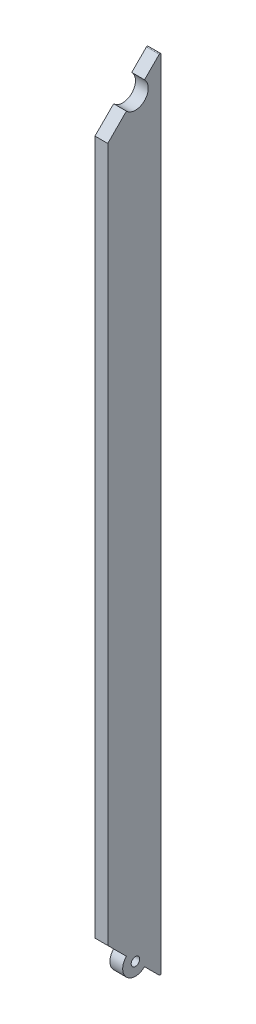
ISO-10303-21;
HEADER;
FILE_DESCRIPTION(('STEP AP214'),'2;1');
FILE_NAME('part.step','',(''),(''),'','','');
FILE_SCHEMA(('AUTOMOTIVE_DESIGN { 1 0 10303 214 1 1 1 1 }'));
ENDSEC;
DATA;
#1=APPLICATION_CONTEXT('core data for automotive mechanical design processes');
#2=APPLICATION_PROTOCOL_DEFINITION('international standard','automotive_design',2000,#1);
#3=PRODUCT_CONTEXT('',#1,'mechanical');
#4=PRODUCT('Part','Part','',(#3));
#5=PRODUCT_RELATED_PRODUCT_CATEGORY('part','',(#4));
#6=PRODUCT_DEFINITION_FORMATION('','',#4);
#7=PRODUCT_DEFINITION_CONTEXT('part definition',#1,'design');
#8=PRODUCT_DEFINITION('design','',#6,#7);
#9=PRODUCT_DEFINITION_SHAPE('','',#8);
#10=(LENGTH_UNIT() NAMED_UNIT(*) SI_UNIT(.MILLI.,.METRE.));
#11=(NAMED_UNIT(*) PLANE_ANGLE_UNIT() SI_UNIT($,.RADIAN.));
#12=(NAMED_UNIT(*) SI_UNIT($,.STERADIAN.) SOLID_ANGLE_UNIT());
#13=UNCERTAINTY_MEASURE_WITH_UNIT(LENGTH_MEASURE(1.E-05),#10,'distance_accuracy_value','');
#14=(GEOMETRIC_REPRESENTATION_CONTEXT(3) GLOBAL_UNCERTAINTY_ASSIGNED_CONTEXT((#13)) GLOBAL_UNIT_ASSIGNED_CONTEXT((#10,
#11,#12)) REPRESENTATION_CONTEXT('',''));
#15=CARTESIAN_POINT('',(0.,0.,0.));
#16=DIRECTION('',(0.,0.,1.));
#17=DIRECTION('',(1.,0.,0.));
#18=AXIS2_PLACEMENT_3D('',#15,#16,#17);
#19=CARTESIAN_POINT('',(6.,351.,25.));
#20=DIRECTION('',(0.,-0.707106781186543,-0.707106781186552));
#21=DIRECTION('',(0.,0.707106781186552,-0.707106781186543));
#22=AXIS2_PLACEMENT_3D('',#19,#20,#21);
#23=PLANE('',#22);
#24=DIRECTION('',(0.,-0.707106781186552,0.707106781186543));
#25=VECTOR('',#24,1.);
#26=CARTESIAN_POINT('',(0.,351.,25.));
#27=LINE('',#26,#25);
#28=CARTESIAN_POINT('',(0.,375.146446609407,0.853553390593283));
#29=VERTEX_POINT('',#28);
#30=CARTESIAN_POINT('',(0.,368.242640687119,7.75735931288068));
#31=VERTEX_POINT('',#30);
#32=EDGE_CURVE('E134',#29,#31,#27,.T.);
#33=ORIENTED_EDGE('',*,*,#32,.T.);
#34=DIRECTION('',(1.,0.,0.));
#35=VECTOR('',#34,1.);
#36=CARTESIAN_POINT('',(0.,368.242640687119,7.75735931288068));
#37=LINE('',#36,#35);
#38=CARTESIAN_POINT('',(6.,368.242640687119,7.75735931288069));
#39=VERTEX_POINT('',#38);
#40=EDGE_CURVE('E53',#31,#39,#37,.T.);
#41=ORIENTED_EDGE('',*,*,#40,.T.);
#42=DIRECTION('',(0.,-0.707106781186552,0.707106781186543));
#43=VECTOR('',#42,1.);
#44=CARTESIAN_POINT('',(6.,351.,25.));
#45=LINE('',#44,#43);
#46=CARTESIAN_POINT('',(6.,375.146446609407,0.853553390593283));
#47=VERTEX_POINT('',#46);
#48=EDGE_CURVE('E166',#47,#39,#45,.T.);
#49=ORIENTED_EDGE('',*,*,#48,.F.);
#50=DIRECTION('',(-1.,0.,0.));
#51=VECTOR('',#50,1.);
#52=CARTESIAN_POINT('',(6.,375.146446609407,0.853553390593283));
#53=LINE('',#52,#51);
#54=EDGE_CURVE('E50',#47,#29,#53,.T.);
#55=ORIENTED_EDGE('',*,*,#54,.T.);
#56=EDGE_LOOP('',(#33,#41,#49,#55));
#57=FACE_BOUND('',#56,.T.);
#58=ADVANCED_FACE('F39',(#57),#23,.F.);
#59=CARTESIAN_POINT('',(6.,24.9999999999999,25.));
#60=DIRECTION('',(0.,0.707106781186549,-0.707106781186546));
#61=DIRECTION('',(0.,0.707106781186546,0.707106781186549));
#62=AXIS2_PLACEMENT_3D('',#59,#60,#61);
#63=PLANE('',#62);
#64=DIRECTION('',(0.,-0.707106781186546,-0.707106781186549));
#65=VECTOR('',#64,1.);
#66=CARTESIAN_POINT('',(6.,24.9999999999999,25.));
#67=LINE('',#66,#65);
#68=CARTESIAN_POINT('',(6.,7.7573593128807,7.75735931288073));
#69=VERTEX_POINT('',#68);
#70=CARTESIAN_POINT('',(6.,0.853553390593287,0.85355339059329));
#71=VERTEX_POINT('',#70);
#72=EDGE_CURVE('E144',#69,#71,#67,.T.);
#73=ORIENTED_EDGE('',*,*,#72,.F.);
#74=DIRECTION('',(-1.,0.,0.));
#75=VECTOR('',#74,1.);
#76=CARTESIAN_POINT('',(22.9705627484771,7.7573593128807,7.75735931288073));
#77=LINE('',#76,#75);
#78=CARTESIAN_POINT('',(0.,7.7573593128807,7.75735931288073));
#79=VERTEX_POINT('',#78);
#80=EDGE_CURVE('E194',#69,#79,#77,.T.);
#81=ORIENTED_EDGE('',*,*,#80,.T.);
#82=DIRECTION('',(0.,-0.707106781186546,-0.707106781186549));
#83=VECTOR('',#82,1.);
#84=CARTESIAN_POINT('',(0.,24.9999999999999,25.));
#85=LINE('',#84,#83);
#86=CARTESIAN_POINT('',(0.,0.853553390593287,0.85355339059329));
#87=VERTEX_POINT('',#86);
#88=EDGE_CURVE('E193',#79,#87,#85,.T.);
#89=ORIENTED_EDGE('',*,*,#88,.T.);
#90=DIRECTION('',(-1.,0.,0.));
#91=VECTOR('',#90,1.);
#92=CARTESIAN_POINT('',(6.,0.853553390593287,0.85355339059329));
#93=LINE('',#92,#91);
#94=EDGE_CURVE('E159',#87,#71,#93,.F.);
#95=ORIENTED_EDGE('',*,*,#94,.T.);
#96=EDGE_LOOP('',(#73,#81,#89,#95));
#97=FACE_BOUND('',#96,.T.);
#98=ADVANCED_FACE('F216',(#97),#63,.F.);
#99=CARTESIAN_POINT('',(0.,24.9999999999999,25.));
#100=VERTEX_POINT('',#99);
#101=CARTESIAN_POINT('',(0.,16.2426406871193,16.2426406871193));
#102=VERTEX_POINT('',#101);
#103=EDGE_CURVE('E136',#100,#102,#85,.T.);
#104=ORIENTED_EDGE('',*,*,#103,.T.);
#105=DIRECTION('',(-1.,0.,0.));
#106=VECTOR('',#105,1.);
#107=CARTESIAN_POINT('',(22.9705627484771,16.2426406871193,16.2426406871193));
#108=LINE('',#107,#106);
#109=CARTESIAN_POINT('',(6.,16.2426406871193,16.2426406871193));
#110=VERTEX_POINT('',#109);
#111=EDGE_CURVE('E197',#102,#110,#108,.F.);
#112=ORIENTED_EDGE('',*,*,#111,.T.);
#113=CARTESIAN_POINT('',(6.,24.9999999999999,25.));
#114=VERTEX_POINT('',#113);
#115=EDGE_CURVE('E184',#114,#110,#67,.T.);
#116=ORIENTED_EDGE('',*,*,#115,.F.);
#117=DIRECTION('',(-1.,0.,0.));
#118=VECTOR('',#117,1.);
#119=CARTESIAN_POINT('',(6.,24.9999999999999,25.));
#120=LINE('',#119,#118);
#121=EDGE_CURVE('E142',#114,#100,#120,.T.);
#122=ORIENTED_EDGE('',*,*,#121,.T.);
#123=EDGE_LOOP('',(#104,#112,#116,#122));
#124=FACE_BOUND('',#123,.T.);
#125=ADVANCED_FACE('F220',(#124),#63,.F.);
#126=CARTESIAN_POINT('',(6.,376.,0.));
#127=DIRECTION('',(0.,0.,1.));
#128=DIRECTION('',(1.,0.,0.));
#129=AXIS2_PLACEMENT_3D('',#126,#127,#128);
#130=PLANE('',#129);
#131=DIRECTION('',(0.,1.,0.));
#132=VECTOR('',#131,1.);
#133=CARTESIAN_POINT('',(6.,376.,0.));
#134=LINE('',#133,#132);
#135=CARTESIAN_POINT('',(6.,1.20710678118657,0.));
#136=VERTEX_POINT('',#135);
#137=CARTESIAN_POINT('',(6.,374.792893218813,0.));
#138=VERTEX_POINT('',#137);
#139=EDGE_CURVE('E181',#136,#138,#134,.T.);
#140=ORIENTED_EDGE('',*,*,#139,.F.);
#141=DIRECTION('',(-1.,0.,0.));
#142=VECTOR('',#141,1.);
#143=CARTESIAN_POINT('',(6.,1.20710678118657,0.));
#144=LINE('',#143,#142);
#145=CARTESIAN_POINT('',(0.,1.20710678118657,0.));
#146=VERTEX_POINT('',#145);
#147=EDGE_CURVE('E154',#136,#146,#144,.T.);
#148=ORIENTED_EDGE('',*,*,#147,.T.);
#149=DIRECTION('',(0.,1.,0.));
#150=VECTOR('',#149,1.);
#151=CARTESIAN_POINT('',(0.,376.,0.));
#152=LINE('',#151,#150);
#153=CARTESIAN_POINT('',(0.,374.792893218813,0.));
#154=VERTEX_POINT('',#153);
#155=EDGE_CURVE('E131',#146,#154,#152,.T.);
#156=ORIENTED_EDGE('',*,*,#155,.T.);
#157=DIRECTION('',(-1.,0.,0.));
#158=VECTOR('',#157,1.);
#159=CARTESIAN_POINT('',(6.,374.792893218813,0.));
#160=LINE('',#159,#158);
#161=EDGE_CURVE('E147',#154,#138,#160,.F.);
#162=ORIENTED_EDGE('',*,*,#161,.T.);
#163=EDGE_LOOP('',(#140,#148,#156,#162));
#164=FACE_BOUND('',#163,.T.);
#165=ADVANCED_FACE('F176',(#164),#130,.F.);
#166=CARTESIAN_POINT('',(6.,359.757359312881,16.2426406871192));
#167=VERTEX_POINT('',#166);
#168=CARTESIAN_POINT('',(6.,351.,25.));
#169=VERTEX_POINT('',#168);
#170=EDGE_CURVE('E126',#167,#169,#45,.T.);
#171=ORIENTED_EDGE('',*,*,#170,.F.);
#172=DIRECTION('',(1.,0.,0.));
#173=VECTOR('',#172,1.);
#174=CARTESIAN_POINT('',(0.,359.757359312881,16.2426406871192));
#175=LINE('',#174,#173);
#176=CARTESIAN_POINT('',(0.,359.757359312881,16.2426406871192));
#177=VERTEX_POINT('',#176);
#178=EDGE_CURVE('E114',#167,#177,#175,.F.);
#179=ORIENTED_EDGE('',*,*,#178,.T.);
#180=CARTESIAN_POINT('',(0.,351.,25.));
#181=VERTEX_POINT('',#180);
#182=EDGE_CURVE('E122',#177,#181,#27,.T.);
#183=ORIENTED_EDGE('',*,*,#182,.T.);
#184=DIRECTION('',(-1.,0.,0.));
#185=VECTOR('',#184,1.);
#186=CARTESIAN_POINT('',(6.,351.,25.));
#187=LINE('',#186,#185);
#188=EDGE_CURVE('E146',#169,#181,#187,.T.);
#189=ORIENTED_EDGE('',*,*,#188,.F.);
#190=EDGE_LOOP('',(#171,#179,#183,#189));
#191=FACE_BOUND('',#190,.T.);
#192=ADVANCED_FACE('F125',(#191),#23,.F.);
#193=CARTESIAN_POINT('',(6.,24.9999999999999,25.));
#194=DIRECTION('',(0.,0.,-1.));
#195=DIRECTION('',(-1.,0.,0.));
#196=AXIS2_PLACEMENT_3D('',#193,#194,#195);
#197=PLANE('',#196);
#198=DIRECTION('',(0.,-1.,0.));
#199=VECTOR('',#198,1.);
#200=CARTESIAN_POINT('',(0.,24.9999999999999,25.));
#201=LINE('',#200,#199);
#202=EDGE_CURVE('E135',#181,#100,#201,.T.);
#203=ORIENTED_EDGE('',*,*,#202,.T.);
#204=ORIENTED_EDGE('',*,*,#121,.F.);
#205=DIRECTION('',(0.,-1.,0.));
#206=VECTOR('',#205,1.);
#207=CARTESIAN_POINT('',(6.,24.9999999999999,25.));
#208=LINE('',#207,#206);
#209=EDGE_CURVE('E150',#169,#114,#208,.T.);
#210=ORIENTED_EDGE('',*,*,#209,.F.);
#211=ORIENTED_EDGE('',*,*,#188,.T.);
#212=EDGE_LOOP('',(#203,#204,#210,#211));
#213=FACE_BOUND('',#212,.T.);
#214=ADVANCED_FACE('F219',(#213),#197,.F.);
#215=CARTESIAN_POINT('',(6.,0.,0.));
#216=DIRECTION('',(1.,0.,0.));
#217=DIRECTION('',(0.,0.,-1.));
#218=AXIS2_PLACEMENT_3D('',#215,#216,#217);
#219=PLANE('',#218);
#220=CARTESIAN_POINT('',(6.,364.,11.9999999999998));
#221=DIRECTION('',(1.,0.,0.));
#222=DIRECTION('',(0.,0.,-1.));
#223=AXIS2_PLACEMENT_3D('',#220,#221,#222);
#224=CIRCLE('',#223,6.);
#225=EDGE_CURVE('E130',#167,#39,#224,.T.);
#226=ORIENTED_EDGE('',*,*,#225,.F.);
#227=ORIENTED_EDGE('',*,*,#170,.T.);
#228=ORIENTED_EDGE('',*,*,#209,.T.);
#229=ORIENTED_EDGE('',*,*,#115,.T.);
#230=CARTESIAN_POINT('',(6.,12.,12.));
#231=DIRECTION('',(1.,0.,0.));
#232=DIRECTION('',(0.,0.,-1.));
#233=AXIS2_PLACEMENT_3D('',#230,#231,#232);
#234=CIRCLE('',#233,6.);
#235=EDGE_CURVE('E64',#69,#110,#234,.F.);
#236=ORIENTED_EDGE('',*,*,#235,.F.);
#237=ORIENTED_EDGE('',*,*,#72,.T.);
#238=CARTESIAN_POINT('',(6.,1.20710678118657,0.5));
#239=DIRECTION('',(1.,0.,0.));
#240=DIRECTION('',(0.,0.,-1.));
#241=AXIS2_PLACEMENT_3D('',#238,#239,#240);
#242=CIRCLE('',#241,0.5);
#243=EDGE_CURVE('E163',#71,#136,#242,.T.);
#244=ORIENTED_EDGE('',*,*,#243,.T.);
#245=ORIENTED_EDGE('',*,*,#139,.T.);
#246=CARTESIAN_POINT('',(6.,374.792893218813,0.5));
#247=DIRECTION('',(1.,0.,0.));
#248=DIRECTION('',(0.,0.,-1.));
#249=AXIS2_PLACEMENT_3D('',#246,#247,#248);
#250=CIRCLE('',#249,0.5);
#251=EDGE_CURVE('E161',#138,#47,#250,.T.);
#252=ORIENTED_EDGE('',*,*,#251,.T.);
#253=ORIENTED_EDGE('',*,*,#48,.T.);
#254=EDGE_LOOP('',(#226,#227,#228,#229,#236,#237,#244,#245,#252,#253));
#255=FACE_BOUND('',#254,.T.);
#256=CARTESIAN_POINT('',(6.,12.,12.));
#257=DIRECTION('',(1.,0.,0.));
#258=DIRECTION('',(0.,0.,-1.));
#259=AXIS2_PLACEMENT_3D('',#256,#257,#258);
#260=CIRCLE('',#259,2.);
#261=CARTESIAN_POINT('',(6.,12.,10.));
#262=VERTEX_POINT('',#261);
#263=EDGE_CURVE('E214',#262,#262,#260,.T.);
#264=ORIENTED_EDGE('',*,*,#263,.F.);
#265=EDGE_LOOP('',(#264));
#266=FACE_BOUND('',#265,.T.);
#267=ADVANCED_FACE('F183',(#255,#266),#219,.T.);
#268=CARTESIAN_POINT('',(0.,0.,0.));
#269=DIRECTION('',(1.,0.,0.));
#270=DIRECTION('',(0.,0.,-1.));
#271=AXIS2_PLACEMENT_3D('',#268,#269,#270);
#272=PLANE('',#271);
#273=CARTESIAN_POINT('',(0.,12.,12.));
#274=DIRECTION('',(1.,0.,0.));
#275=DIRECTION('',(0.,0.,-1.));
#276=AXIS2_PLACEMENT_3D('',#273,#274,#275);
#277=CIRCLE('',#276,2.);
#278=CARTESIAN_POINT('',(0.,12.,10.));
#279=VERTEX_POINT('',#278);
#280=EDGE_CURVE('E209',#279,#279,#277,.T.);
#281=ORIENTED_EDGE('',*,*,#280,.T.);
#282=EDGE_LOOP('',(#281));
#283=FACE_BOUND('',#282,.T.);
#284=ORIENTED_EDGE('',*,*,#182,.F.);
#285=CARTESIAN_POINT('',(0.,364.,11.9999999999998));
#286=DIRECTION('',(1.,0.,0.));
#287=DIRECTION('',(0.,0.,-1.));
#288=AXIS2_PLACEMENT_3D('',#285,#286,#287);
#289=CIRCLE('',#288,6.);
#290=EDGE_CURVE('E11',#177,#31,#289,.T.);
#291=ORIENTED_EDGE('',*,*,#290,.T.);
#292=ORIENTED_EDGE('',*,*,#32,.F.);
#293=CARTESIAN_POINT('',(0.,374.792893218813,0.5));
#294=DIRECTION('',(1.,0.,0.));
#295=DIRECTION('',(0.,0.,-1.));
#296=AXIS2_PLACEMENT_3D('',#293,#294,#295);
#297=CIRCLE('',#296,0.5);
#298=EDGE_CURVE('E153',#29,#154,#297,.F.);
#299=ORIENTED_EDGE('',*,*,#298,.T.);
#300=ORIENTED_EDGE('',*,*,#155,.F.);
#301=CARTESIAN_POINT('',(0.,1.20710678118657,0.5));
#302=DIRECTION('',(1.,0.,0.));
#303=DIRECTION('',(0.,0.,-1.));
#304=AXIS2_PLACEMENT_3D('',#301,#302,#303);
#305=CIRCLE('',#304,0.5);
#306=EDGE_CURVE('E157',#146,#87,#305,.F.);
#307=ORIENTED_EDGE('',*,*,#306,.T.);
#308=ORIENTED_EDGE('',*,*,#88,.F.);
#309=CARTESIAN_POINT('',(0.,12.,12.));
#310=DIRECTION('',(-1.,0.,0.));
#311=DIRECTION('',(0.,0.,1.));
#312=AXIS2_PLACEMENT_3D('',#309,#310,#311);
#313=CIRCLE('',#312,6.);
#314=EDGE_CURVE('E203',#79,#102,#313,.T.);
#315=ORIENTED_EDGE('',*,*,#314,.T.);
#316=ORIENTED_EDGE('',*,*,#103,.F.);
#317=ORIENTED_EDGE('',*,*,#202,.F.);
#318=EDGE_LOOP('',(#284,#291,#292,#299,#300,#307,#308,#315,#316,#317));
#319=FACE_BOUND('',#318,.T.);
#320=ADVANCED_FACE('F129',(#283,#319),#272,.F.);
#321=CARTESIAN_POINT('',(6.,1.20710678118657,0.5));
#322=DIRECTION('',(-1.,0.,0.));
#323=DIRECTION('',(0.,0.,1.));
#324=AXIS2_PLACEMENT_3D('',#321,#322,#323);
#325=CYLINDRICAL_SURFACE('',#324,0.5);
#326=ORIENTED_EDGE('',*,*,#243,.F.);
#327=ORIENTED_EDGE('',*,*,#94,.F.);
#328=ORIENTED_EDGE('',*,*,#306,.F.);
#329=ORIENTED_EDGE('',*,*,#147,.F.);
#330=EDGE_LOOP('',(#326,#327,#328,#329));
#331=FACE_BOUND('',#330,.T.);
#332=ADVANCED_FACE('F223',(#331),#325,.T.);
#333=CARTESIAN_POINT('',(6.,374.792893218813,0.5));
#334=DIRECTION('',(-1.,0.,0.));
#335=DIRECTION('',(0.,0.,1.));
#336=AXIS2_PLACEMENT_3D('',#333,#334,#335);
#337=CYLINDRICAL_SURFACE('',#336,0.5);
#338=ORIENTED_EDGE('',*,*,#251,.F.);
#339=ORIENTED_EDGE('',*,*,#161,.F.);
#340=ORIENTED_EDGE('',*,*,#298,.F.);
#341=ORIENTED_EDGE('',*,*,#54,.F.);
#342=EDGE_LOOP('',(#338,#339,#340,#341));
#343=FACE_BOUND('',#342,.T.);
#344=ADVANCED_FACE('F41',(#343),#337,.T.);
#345=CARTESIAN_POINT('',(22.9705627484771,12.,12.));
#346=DIRECTION('',(-1.,0.,0.));
#347=DIRECTION('',(0.,0.,1.));
#348=AXIS2_PLACEMENT_3D('',#345,#346,#347);
#349=CYLINDRICAL_SURFACE('',#348,6.);
#350=ORIENTED_EDGE('',*,*,#80,.F.);
#351=ORIENTED_EDGE('',*,*,#235,.T.);
#352=ORIENTED_EDGE('',*,*,#111,.F.);
#353=ORIENTED_EDGE('',*,*,#314,.F.);
#354=EDGE_LOOP('',(#350,#351,#352,#353));
#355=FACE_BOUND('',#354,.T.);
#356=ADVANCED_FACE('F222',(#355),#349,.T.);
#357=CARTESIAN_POINT('',(0.,12.,12.));
#358=DIRECTION('',(1.,0.,0.));
#359=DIRECTION('',(0.,0.,-1.));
#360=AXIS2_PLACEMENT_3D('',#357,#358,#359);
#361=CYLINDRICAL_SURFACE('',#360,2.);
#362=ORIENTED_EDGE('',*,*,#280,.F.);
#363=EDGE_LOOP('',(#362));
#364=FACE_BOUND('',#363,.T.);
#365=ORIENTED_EDGE('',*,*,#263,.T.);
#366=EDGE_LOOP('',(#365));
#367=FACE_BOUND('',#366,.T.);
#368=ADVANCED_FACE('F229',(#364,#367),#361,.F.);
#369=CARTESIAN_POINT('',(0.,364.,11.9999999999998));
#370=DIRECTION('',(1.,0.,0.));
#371=DIRECTION('',(0.,0.,-1.));
#372=AXIS2_PLACEMENT_3D('',#369,#370,#371);
#373=CYLINDRICAL_SURFACE('',#372,6.);
#374=ORIENTED_EDGE('',*,*,#290,.F.);
#375=ORIENTED_EDGE('',*,*,#178,.F.);
#376=ORIENTED_EDGE('',*,*,#225,.T.);
#377=ORIENTED_EDGE('',*,*,#40,.F.);
#378=EDGE_LOOP('',(#374,#375,#376,#377));
#379=FACE_BOUND('',#378,.T.);
#380=ADVANCED_FACE('F111',(#379),#373,.F.);
#381=CLOSED_SHELL('',(#58,#98,#125,#165,#192,#214,#267,#320,#332,#344,#356,#368,#380));
#382=MANIFOLD_SOLID_BREP('B2',#381);
#383=ADVANCED_BREP_SHAPE_REPRESENTATION('',(#18,#382),#14);
#384=SHAPE_DEFINITION_REPRESENTATION(#9,#383);
ENDSEC;
END-ISO-10303-21;
